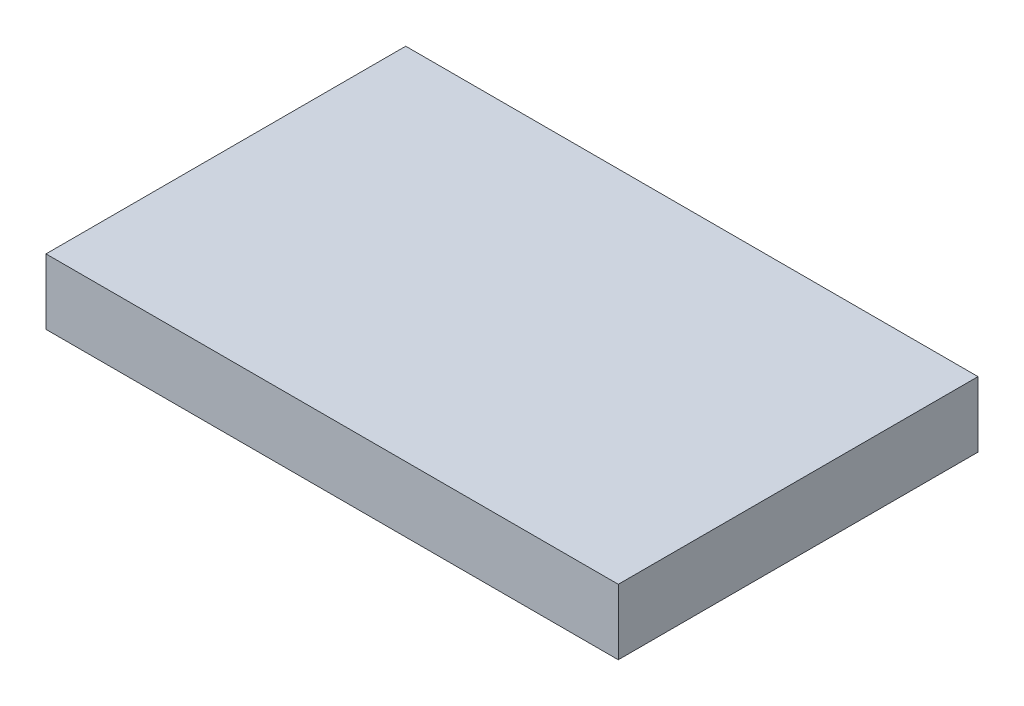
ISO-10303-21;
HEADER;
FILE_DESCRIPTION(('STEP AP214'),'2;1');
FILE_NAME('part.step','',(''),(''),'','','');
FILE_SCHEMA(('AUTOMOTIVE_DESIGN { 1 0 10303 214 1 1 1 1 }'));
ENDSEC;
DATA;
#1=APPLICATION_CONTEXT('core data for automotive mechanical design processes');
#2=APPLICATION_PROTOCOL_DEFINITION('international standard','automotive_design',2000,#1);
#3=PRODUCT_CONTEXT('',#1,'mechanical');
#4=PRODUCT('Part','Part','',(#3));
#5=PRODUCT_RELATED_PRODUCT_CATEGORY('part','',(#4));
#6=PRODUCT_DEFINITION_FORMATION('','',#4);
#7=PRODUCT_DEFINITION_CONTEXT('part definition',#1,'design');
#8=PRODUCT_DEFINITION('design','',#6,#7);
#9=PRODUCT_DEFINITION_SHAPE('','',#8);
#10=(LENGTH_UNIT() NAMED_UNIT(*) SI_UNIT(.MILLI.,.METRE.));
#11=(NAMED_UNIT(*) PLANE_ANGLE_UNIT() SI_UNIT($,.RADIAN.));
#12=(NAMED_UNIT(*) SI_UNIT($,.STERADIAN.) SOLID_ANGLE_UNIT());
#13=UNCERTAINTY_MEASURE_WITH_UNIT(LENGTH_MEASURE(1.E-05),#10,'distance_accuracy_value','');
#14=(GEOMETRIC_REPRESENTATION_CONTEXT(3) GLOBAL_UNCERTAINTY_ASSIGNED_CONTEXT((#13)) GLOBAL_UNIT_ASSIGNED_CONTEXT((#10,
#11,#12)) REPRESENTATION_CONTEXT('',''));
#15=CARTESIAN_POINT('',(0.,0.,0.));
#16=DIRECTION('',(0.,0.,1.));
#17=DIRECTION('',(1.,0.,0.));
#18=AXIS2_PLACEMENT_3D('',#15,#16,#17);
#19=CARTESIAN_POINT('',(0.,6.35,0.));
#20=DIRECTION('',(1.,0.,0.));
#21=DIRECTION('',(0.,0.,-1.));
#22=AXIS2_PLACEMENT_3D('',#19,#20,#21);
#23=PLANE('',#22);
#24=DIRECTION('',(0.,0.,1.));
#25=VECTOR('',#24,1.);
#26=CARTESIAN_POINT('',(0.,0.,0.));
#27=LINE('',#26,#25);
#28=CARTESIAN_POINT('',(0.,0.,-34.925));
#29=VERTEX_POINT('',#28);
#30=CARTESIAN_POINT('',(0.,0.,0.));
#31=VERTEX_POINT('',#30);
#32=EDGE_CURVE('E96',#29,#31,#27,.T.);
#33=ORIENTED_EDGE('',*,*,#32,.T.);
#34=DIRECTION('',(0.,-1.,0.));
#35=VECTOR('',#34,1.);
#36=CARTESIAN_POINT('',(0.,6.35,0.));
#37=LINE('',#36,#35);
#38=CARTESIAN_POINT('',(0.,6.35,0.));
#39=VERTEX_POINT('',#38);
#40=EDGE_CURVE('E11',#39,#31,#37,.T.);
#41=ORIENTED_EDGE('',*,*,#40,.F.);
#42=DIRECTION('',(0.,0.,1.));
#43=VECTOR('',#42,1.);
#44=CARTESIAN_POINT('',(0.,6.35,0.));
#45=LINE('',#44,#43);
#46=CARTESIAN_POINT('',(0.,6.35,-34.925));
#47=VERTEX_POINT('',#46);
#48=EDGE_CURVE('E84',#47,#39,#45,.T.);
#49=ORIENTED_EDGE('',*,*,#48,.F.);
#50=DIRECTION('',(0.,-1.,0.));
#51=VECTOR('',#50,1.);
#52=CARTESIAN_POINT('',(0.,6.35,-34.925));
#53=LINE('',#52,#51);
#54=EDGE_CURVE('E92',#47,#29,#53,.T.);
#55=ORIENTED_EDGE('',*,*,#54,.T.);
#56=EDGE_LOOP('',(#33,#41,#49,#55));
#57=FACE_BOUND('',#56,.T.);
#58=ADVANCED_FACE('F33',(#57),#23,.F.);
#59=CARTESIAN_POINT('',(0.,6.35,0.));
#60=DIRECTION('',(0.,0.,-1.));
#61=DIRECTION('',(-1.,0.,0.));
#62=AXIS2_PLACEMENT_3D('',#59,#60,#61);
#63=PLANE('',#62);
#64=DIRECTION('',(1.,0.,0.));
#65=VECTOR('',#64,1.);
#66=CARTESIAN_POINT('',(0.,0.,0.));
#67=LINE('',#66,#65);
#68=CARTESIAN_POINT('',(55.5625,0.,0.));
#69=VERTEX_POINT('',#68);
#70=EDGE_CURVE('E88',#31,#69,#67,.T.);
#71=ORIENTED_EDGE('',*,*,#70,.T.);
#72=DIRECTION('',(0.,-1.,0.));
#73=VECTOR('',#72,1.);
#74=CARTESIAN_POINT('',(55.5625,6.35,0.));
#75=LINE('',#74,#73);
#76=CARTESIAN_POINT('',(55.5625,6.35,0.));
#77=VERTEX_POINT('',#76);
#78=EDGE_CURVE('E41',#77,#69,#75,.T.);
#79=ORIENTED_EDGE('',*,*,#78,.F.);
#80=DIRECTION('',(1.,0.,0.));
#81=VECTOR('',#80,1.);
#82=CARTESIAN_POINT('',(0.,6.35,0.));
#83=LINE('',#82,#81);
#84=EDGE_CURVE('E79',#39,#77,#83,.T.);
#85=ORIENTED_EDGE('',*,*,#84,.F.);
#86=ORIENTED_EDGE('',*,*,#40,.T.);
#87=EDGE_LOOP('',(#71,#79,#85,#86));
#88=FACE_BOUND('',#87,.T.);
#89=ADVANCED_FACE('F87',(#88),#63,.F.);
#90=CARTESIAN_POINT('',(55.5625,6.35,0.));
#91=DIRECTION('',(-1.,0.,0.));
#92=DIRECTION('',(0.,0.,1.));
#93=AXIS2_PLACEMENT_3D('',#90,#91,#92);
#94=PLANE('',#93);
#95=DIRECTION('',(0.,0.,-1.));
#96=VECTOR('',#95,1.);
#97=CARTESIAN_POINT('',(55.5625,0.,0.));
#98=LINE('',#97,#96);
#99=CARTESIAN_POINT('',(55.5625,0.,-34.925));
#100=VERTEX_POINT('',#99);
#101=EDGE_CURVE('E66',#69,#100,#98,.T.);
#102=ORIENTED_EDGE('',*,*,#101,.T.);
#103=DIRECTION('',(0.,-1.,0.));
#104=VECTOR('',#103,1.);
#105=CARTESIAN_POINT('',(55.5625,6.35,-34.925));
#106=LINE('',#105,#104);
#107=CARTESIAN_POINT('',(55.5625,6.35,-34.925));
#108=VERTEX_POINT('',#107);
#109=EDGE_CURVE('E89',#108,#100,#106,.T.);
#110=ORIENTED_EDGE('',*,*,#109,.F.);
#111=DIRECTION('',(0.,0.,-1.));
#112=VECTOR('',#111,1.);
#113=CARTESIAN_POINT('',(55.5625,6.35,0.));
#114=LINE('',#113,#112);
#115=EDGE_CURVE('E82',#77,#108,#114,.T.);
#116=ORIENTED_EDGE('',*,*,#115,.F.);
#117=ORIENTED_EDGE('',*,*,#78,.T.);
#118=EDGE_LOOP('',(#102,#110,#116,#117));
#119=FACE_BOUND('',#118,.T.);
#120=ADVANCED_FACE('F90',(#119),#94,.F.);
#121=CARTESIAN_POINT('',(0.,6.35,-34.925));
#122=DIRECTION('',(0.,0.,1.));
#123=DIRECTION('',(1.,0.,0.));
#124=AXIS2_PLACEMENT_3D('',#121,#122,#123);
#125=PLANE('',#124);
#126=DIRECTION('',(-1.,0.,0.));
#127=VECTOR('',#126,1.);
#128=CARTESIAN_POINT('',(0.,0.,-34.925));
#129=LINE('',#128,#127);
#130=EDGE_CURVE('E72',#100,#29,#129,.T.);
#131=ORIENTED_EDGE('',*,*,#130,.T.);
#132=ORIENTED_EDGE('',*,*,#54,.F.);
#133=DIRECTION('',(-1.,0.,0.));
#134=VECTOR('',#133,1.);
#135=CARTESIAN_POINT('',(0.,6.35,-34.925));
#136=LINE('',#135,#134);
#137=EDGE_CURVE('E49',#108,#47,#136,.T.);
#138=ORIENTED_EDGE('',*,*,#137,.F.);
#139=ORIENTED_EDGE('',*,*,#109,.T.);
#140=EDGE_LOOP('',(#131,#132,#138,#139));
#141=FACE_BOUND('',#140,.T.);
#142=ADVANCED_FACE('F103',(#141),#125,.F.);
#143=CARTESIAN_POINT('',(0.,6.35,0.));
#144=DIRECTION('',(0.,-1.,0.));
#145=DIRECTION('',(0.,0.,-1.));
#146=AXIS2_PLACEMENT_3D('',#143,#144,#145);
#147=PLANE('',#146);
#148=ORIENTED_EDGE('',*,*,#48,.T.);
#149=ORIENTED_EDGE('',*,*,#84,.T.);
#150=ORIENTED_EDGE('',*,*,#115,.T.);
#151=ORIENTED_EDGE('',*,*,#137,.T.);
#152=EDGE_LOOP('',(#148,#149,#150,#151));
#153=FACE_BOUND('',#152,.T.);
#154=ADVANCED_FACE('F80',(#153),#147,.F.);
#155=CARTESIAN_POINT('',(0.,0.,0.));
#156=DIRECTION('',(0.,-1.,0.));
#157=DIRECTION('',(0.,0.,-1.));
#158=AXIS2_PLACEMENT_3D('',#155,#156,#157);
#159=PLANE('',#158);
#160=ORIENTED_EDGE('',*,*,#32,.F.);
#161=ORIENTED_EDGE('',*,*,#130,.F.);
#162=ORIENTED_EDGE('',*,*,#101,.F.);
#163=ORIENTED_EDGE('',*,*,#70,.F.);
#164=EDGE_LOOP('',(#160,#161,#162,#163));
#165=FACE_BOUND('',#164,.T.);
#166=ADVANCED_FACE('F106',(#165),#159,.T.);
#167=CLOSED_SHELL('',(#58,#89,#120,#142,#154,#166));
#168=MANIFOLD_SOLID_BREP('B2',#167);
#169=ADVANCED_BREP_SHAPE_REPRESENTATION('',(#18,#168),#14);
#170=SHAPE_DEFINITION_REPRESENTATION(#9,#169);
ENDSEC;
END-ISO-10303-21;
